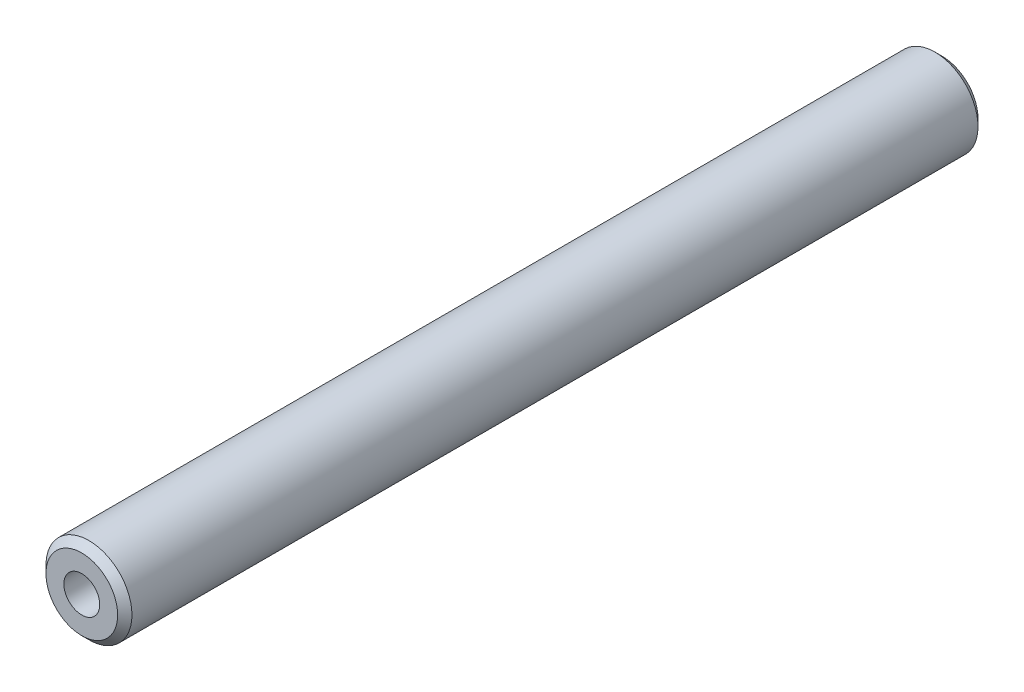
ISO-10303-21;
HEADER;
FILE_DESCRIPTION(('STEP AP214'),'2;1');
FILE_NAME('part.step','',(''),(''),'','','');
FILE_SCHEMA(('AUTOMOTIVE_DESIGN { 1 0 10303 214 1 1 1 1 }'));
ENDSEC;
DATA;
#1=APPLICATION_CONTEXT('core data for automotive mechanical design processes');
#2=APPLICATION_PROTOCOL_DEFINITION('international standard','automotive_design',2000,#1);
#3=PRODUCT_CONTEXT('',#1,'mechanical');
#4=PRODUCT('Part','Part','',(#3));
#5=PRODUCT_RELATED_PRODUCT_CATEGORY('part','',(#4));
#6=PRODUCT_DEFINITION_FORMATION('','',#4);
#7=PRODUCT_DEFINITION_CONTEXT('part definition',#1,'design');
#8=PRODUCT_DEFINITION('design','',#6,#7);
#9=PRODUCT_DEFINITION_SHAPE('','',#8);
#10=(LENGTH_UNIT() NAMED_UNIT(*) SI_UNIT(.MILLI.,.METRE.));
#11=(NAMED_UNIT(*) PLANE_ANGLE_UNIT() SI_UNIT($,.RADIAN.));
#12=(NAMED_UNIT(*) SI_UNIT($,.STERADIAN.) SOLID_ANGLE_UNIT());
#13=UNCERTAINTY_MEASURE_WITH_UNIT(LENGTH_MEASURE(1.E-05),#10,'distance_accuracy_value','');
#14=(GEOMETRIC_REPRESENTATION_CONTEXT(3) GLOBAL_UNCERTAINTY_ASSIGNED_CONTEXT((#13)) GLOBAL_UNIT_ASSIGNED_CONTEXT((#10,
#11,#12)) REPRESENTATION_CONTEXT('',''));
#15=CARTESIAN_POINT('',(0.,0.,0.));
#16=DIRECTION('',(0.,0.,1.));
#17=DIRECTION('',(1.,0.,0.));
#18=AXIS2_PLACEMENT_3D('',#15,#16,#17);
#19=CARTESIAN_POINT('',(0.,0.,30.));
#20=DIRECTION('',(0.,0.,-1.));
#21=DIRECTION('',(-1.,0.,0.));
#22=AXIS2_PLACEMENT_3D('',#19,#20,#21);
#23=CYLINDRICAL_SURFACE('',#22,3.);
#24=CARTESIAN_POINT('',(0.,0.,-29.5));
#25=DIRECTION('',(0.,0.,1.));
#26=DIRECTION('',(1.,0.,0.));
#27=AXIS2_PLACEMENT_3D('',#24,#25,#26);
#28=CIRCLE('',#27,3.);
#29=CARTESIAN_POINT('',(3.,0.,-29.5));
#30=VERTEX_POINT('',#29);
#31=EDGE_CURVE('E99',#30,#30,#28,.T.);
#32=ORIENTED_EDGE('',*,*,#31,.T.);
#33=EDGE_LOOP('',(#32));
#34=FACE_BOUND('',#33,.T.);
#35=CARTESIAN_POINT('',(0.,0.,29.5));
#36=DIRECTION('',(0.,0.,1.));
#37=DIRECTION('',(1.,0.,0.));
#38=AXIS2_PLACEMENT_3D('',#35,#36,#37);
#39=CIRCLE('',#38,3.);
#40=CARTESIAN_POINT('',(3.,0.,29.5));
#41=VERTEX_POINT('',#40);
#42=EDGE_CURVE('E95',#41,#41,#39,.F.);
#43=ORIENTED_EDGE('',*,*,#42,.T.);
#44=EDGE_LOOP('',(#43));
#45=FACE_BOUND('',#44,.T.);
#46=ADVANCED_FACE('F52',(#34,#45),#23,.T.);
#47=CARTESIAN_POINT('',(0.,0.,30.));
#48=DIRECTION('',(0.,0.,1.));
#49=DIRECTION('',(1.,0.,0.));
#50=AXIS2_PLACEMENT_3D('',#47,#48,#49);
#51=PLANE('',#50);
#52=CARTESIAN_POINT('',(0.,0.,30.));
#53=DIRECTION('',(0.,0.,1.));
#54=DIRECTION('',(1.,0.,0.));
#55=AXIS2_PLACEMENT_3D('',#52,#53,#54);
#56=CIRCLE('',#55,2.5);
#57=CARTESIAN_POINT('',(2.5,0.,30.));
#58=VERTEX_POINT('',#57);
#59=EDGE_CURVE('E11',#58,#58,#56,.T.);
#60=ORIENTED_EDGE('',*,*,#59,.T.);
#61=EDGE_LOOP('',(#60));
#62=FACE_BOUND('',#61,.T.);
#63=CARTESIAN_POINT('',(0.,0.,30.));
#64=DIRECTION('',(0.,0.,1.));
#65=DIRECTION('',(1.,0.,0.));
#66=AXIS2_PLACEMENT_3D('',#63,#64,#65);
#67=CIRCLE('',#66,1.24999999999999);
#68=CARTESIAN_POINT('',(1.24999999999999,0.,30.));
#69=VERTEX_POINT('',#68);
#70=EDGE_CURVE('E79',#69,#69,#67,.T.);
#71=ORIENTED_EDGE('',*,*,#70,.F.);
#72=EDGE_LOOP('',(#71));
#73=FACE_BOUND('',#72,.T.);
#74=ADVANCED_FACE('F118',(#62,#73),#51,.T.);
#75=CARTESIAN_POINT('',(0.,0.,-30.));
#76=DIRECTION('',(0.,0.,1.));
#77=DIRECTION('',(1.,0.,0.));
#78=AXIS2_PLACEMENT_3D('',#75,#76,#77);
#79=PLANE('',#78);
#80=CARTESIAN_POINT('',(0.,0.,-30.));
#81=DIRECTION('',(0.,0.,1.));
#82=DIRECTION('',(1.,0.,0.));
#83=AXIS2_PLACEMENT_3D('',#80,#81,#82);
#84=CIRCLE('',#83,2.49999999999999);
#85=CARTESIAN_POINT('',(2.49999999999999,0.,-30.));
#86=VERTEX_POINT('',#85);
#87=EDGE_CURVE('E61',#86,#86,#84,.F.);
#88=ORIENTED_EDGE('',*,*,#87,.T.);
#89=EDGE_LOOP('',(#88));
#90=FACE_BOUND('',#89,.T.);
#91=CARTESIAN_POINT('',(0.,0.,-30.));
#92=DIRECTION('',(0.,0.,-1.));
#93=DIRECTION('',(-1.,0.,0.));
#94=AXIS2_PLACEMENT_3D('',#91,#92,#93);
#95=CIRCLE('',#94,1.24999999999999);
#96=CARTESIAN_POINT('',(-1.24999999999999,0.,-30.));
#97=VERTEX_POINT('',#96);
#98=EDGE_CURVE('E80',#97,#97,#95,.T.);
#99=ORIENTED_EDGE('',*,*,#98,.F.);
#100=EDGE_LOOP('',(#99));
#101=FACE_BOUND('',#100,.T.);
#102=ADVANCED_FACE('F108',(#90,#101),#79,.F.);
#103=CARTESIAN_POINT('',(0.,0.,21.5));
#104=DIRECTION('',(0.,0.,1.));
#105=DIRECTION('',(1.,0.,0.));
#106=AXIS2_PLACEMENT_3D('',#103,#104,#105);
#107=CONICAL_SURFACE('',#106,1.24999999999999,1.02974425867665);
#108=CARTESIAN_POINT('',(0.,0.,20.7489242262155));
#109=VERTEX_POINT('',#108);
#110=VERTEX_LOOP('',#109);
#111=FACE_BOUND('',#110,.T.);
#112=CARTESIAN_POINT('',(0.,0.,21.5));
#113=DIRECTION('',(0.,0.,1.));
#114=DIRECTION('',(1.,0.,0.));
#115=AXIS2_PLACEMENT_3D('',#112,#113,#114);
#116=CIRCLE('',#115,1.24999999999999);
#117=CARTESIAN_POINT('',(1.24999999999999,0.,21.5));
#118=VERTEX_POINT('',#117);
#119=EDGE_CURVE('E87',#118,#118,#116,.T.);
#120=ORIENTED_EDGE('',*,*,#119,.T.);
#121=EDGE_LOOP('',(#120));
#122=FACE_BOUND('',#121,.T.);
#123=ADVANCED_FACE('F132',(#111,#122),#107,.F.);
#124=CARTESIAN_POINT('',(0.,0.,30.));
#125=DIRECTION('',(0.,0.,1.));
#126=DIRECTION('',(1.,0.,0.));
#127=AXIS2_PLACEMENT_3D('',#124,#125,#126);
#128=CYLINDRICAL_SURFACE('',#127,1.24999999999999);
#129=ORIENTED_EDGE('',*,*,#119,.F.);
#130=EDGE_LOOP('',(#129));
#131=FACE_BOUND('',#130,.T.);
#132=ORIENTED_EDGE('',*,*,#70,.T.);
#133=EDGE_LOOP('',(#132));
#134=FACE_BOUND('',#133,.T.);
#135=ADVANCED_FACE('F72',(#131,#134),#128,.F.);
#136=CARTESIAN_POINT('',(0.,0.,-21.5));
#137=DIRECTION('',(0.,0.,-1.));
#138=DIRECTION('',(-1.,0.,0.));
#139=AXIS2_PLACEMENT_3D('',#136,#137,#138);
#140=CONICAL_SURFACE('',#139,1.24999999999999,1.02974425867665);
#141=CARTESIAN_POINT('',(0.,0.,-20.7489242262155));
#142=VERTEX_POINT('',#141);
#143=VERTEX_LOOP('',#142);
#144=FACE_BOUND('',#143,.T.);
#145=CARTESIAN_POINT('',(0.,0.,-21.5));
#146=DIRECTION('',(0.,0.,-1.));
#147=DIRECTION('',(-1.,0.,0.));
#148=AXIS2_PLACEMENT_3D('',#145,#146,#147);
#149=CIRCLE('',#148,1.24999999999999);
#150=CARTESIAN_POINT('',(-1.24999999999999,0.,-21.5));
#151=VERTEX_POINT('',#150);
#152=EDGE_CURVE('E76',#151,#151,#149,.T.);
#153=ORIENTED_EDGE('',*,*,#152,.T.);
#154=EDGE_LOOP('',(#153));
#155=FACE_BOUND('',#154,.T.);
#156=ADVANCED_FACE('F68',(#144,#155),#140,.F.);
#157=CARTESIAN_POINT('',(0.,0.,-30.));
#158=DIRECTION('',(0.,0.,-1.));
#159=DIRECTION('',(-1.,0.,0.));
#160=AXIS2_PLACEMENT_3D('',#157,#158,#159);
#161=CYLINDRICAL_SURFACE('',#160,1.24999999999999);
#162=ORIENTED_EDGE('',*,*,#152,.F.);
#163=EDGE_LOOP('',(#162));
#164=FACE_BOUND('',#163,.T.);
#165=ORIENTED_EDGE('',*,*,#98,.T.);
#166=EDGE_LOOP('',(#165));
#167=FACE_BOUND('',#166,.T.);
#168=ADVANCED_FACE('F71',(#164,#167),#161,.F.);
#169=CARTESIAN_POINT('',(0.,0.,-29.5));
#170=DIRECTION('',(0.,0.,1.));
#171=DIRECTION('',(1.,0.,0.));
#172=AXIS2_PLACEMENT_3D('',#169,#170,#171);
#173=CONICAL_SURFACE('',#172,3.,0.785398163397453);
#174=ORIENTED_EDGE('',*,*,#87,.F.);
#175=EDGE_LOOP('',(#174));
#176=FACE_BOUND('',#175,.T.);
#177=ORIENTED_EDGE('',*,*,#31,.F.);
#178=EDGE_LOOP('',(#177));
#179=FACE_BOUND('',#178,.T.);
#180=ADVANCED_FACE('F111',(#176,#179),#173,.T.);
#181=CARTESIAN_POINT('',(0.,0.,30.));
#182=DIRECTION('',(0.,0.,-1.));
#183=DIRECTION('',(-1.,0.,0.));
#184=AXIS2_PLACEMENT_3D('',#181,#182,#183);
#185=CONICAL_SURFACE('',#184,2.5,0.785398163397446);
#186=ORIENTED_EDGE('',*,*,#42,.F.);
#187=EDGE_LOOP('',(#186));
#188=FACE_BOUND('',#187,.T.);
#189=ORIENTED_EDGE('',*,*,#59,.F.);
#190=EDGE_LOOP('',(#189));
#191=FACE_BOUND('',#190,.T.);
#192=ADVANCED_FACE('F54',(#188,#191),#185,.T.);
#193=CLOSED_SHELL('',(#46,#74,#102,#123,#135,#156,#168,#180,#192));
#194=MANIFOLD_SOLID_BREP('B2',#193);
#195=ADVANCED_BREP_SHAPE_REPRESENTATION('',(#18,#194),#14);
#196=SHAPE_DEFINITION_REPRESENTATION(#9,#195);
ENDSEC;
END-ISO-10303-21;
